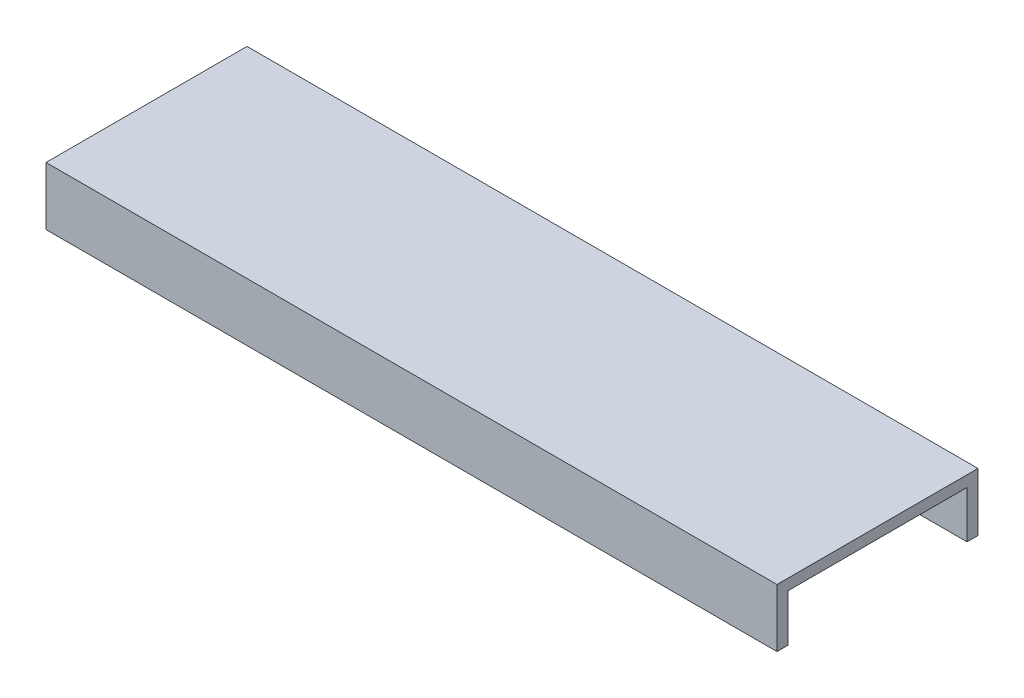
ISO-10303-21;
HEADER;
FILE_DESCRIPTION(('STEP AP214'),'2;1');
FILE_NAME('part.step','',(''),(''),'','','');
FILE_SCHEMA(('AUTOMOTIVE_DESIGN { 1 0 10303 214 1 1 1 1 }'));
ENDSEC;
DATA;
#1=APPLICATION_CONTEXT('core data for automotive mechanical design processes');
#2=APPLICATION_PROTOCOL_DEFINITION('international standard','automotive_design',2000,#1);
#3=PRODUCT_CONTEXT('',#1,'mechanical');
#4=PRODUCT('Part','Part','',(#3));
#5=PRODUCT_RELATED_PRODUCT_CATEGORY('part','',(#4));
#6=PRODUCT_DEFINITION_FORMATION('','',#4);
#7=PRODUCT_DEFINITION_CONTEXT('part definition',#1,'design');
#8=PRODUCT_DEFINITION('design','',#6,#7);
#9=PRODUCT_DEFINITION_SHAPE('','',#8);
#10=(LENGTH_UNIT() NAMED_UNIT(*) SI_UNIT(.MILLI.,.METRE.));
#11=(NAMED_UNIT(*) PLANE_ANGLE_UNIT() SI_UNIT($,.RADIAN.));
#12=(NAMED_UNIT(*) SI_UNIT($,.STERADIAN.) SOLID_ANGLE_UNIT());
#13=UNCERTAINTY_MEASURE_WITH_UNIT(LENGTH_MEASURE(1.E-05),#10,'distance_accuracy_value','');
#14=(GEOMETRIC_REPRESENTATION_CONTEXT(3) GLOBAL_UNCERTAINTY_ASSIGNED_CONTEXT((#13)) GLOBAL_UNIT_ASSIGNED_CONTEXT((#10,
#11,#12)) REPRESENTATION_CONTEXT('',''));
#15=CARTESIAN_POINT('',(0.,0.,0.));
#16=DIRECTION('',(0.,0.,1.));
#17=DIRECTION('',(1.,0.,0.));
#18=AXIS2_PLACEMENT_3D('',#15,#16,#17);
#19=CARTESIAN_POINT('',(100.,6.45,12.25));
#20=DIRECTION('',(0.,0.,1.));
#21=DIRECTION('',(1.,0.,0.));
#22=AXIS2_PLACEMENT_3D('',#19,#20,#21);
#23=PLANE('',#22);
#24=DIRECTION('',(0.,1.,0.));
#25=VECTOR('',#24,1.);
#26=CARTESIAN_POINT('',(0.,6.45,12.25));
#27=LINE('',#26,#25);
#28=CARTESIAN_POINT('',(0.,0.,12.25));
#29=VERTEX_POINT('',#28);
#30=CARTESIAN_POINT('',(0.,6.45,12.25));
#31=VERTEX_POINT('',#30);
#32=EDGE_CURVE('E146',#29,#31,#27,.T.);
#33=ORIENTED_EDGE('',*,*,#32,.T.);
#34=DIRECTION('',(-1.,0.,0.));
#35=VECTOR('',#34,1.);
#36=CARTESIAN_POINT('',(100.,6.45,12.25));
#37=LINE('',#36,#35);
#38=CARTESIAN_POINT('',(100.,6.45,12.25));
#39=VERTEX_POINT('',#38);
#40=EDGE_CURVE('E11',#39,#31,#37,.T.);
#41=ORIENTED_EDGE('',*,*,#40,.F.);
#42=DIRECTION('',(0.,1.,0.));
#43=VECTOR('',#42,1.);
#44=CARTESIAN_POINT('',(100.,6.45,12.25));
#45=LINE('',#44,#43);
#46=CARTESIAN_POINT('',(100.,0.,12.25));
#47=VERTEX_POINT('',#46);
#48=EDGE_CURVE('E168',#47,#39,#45,.T.);
#49=ORIENTED_EDGE('',*,*,#48,.F.);
#50=DIRECTION('',(-1.,0.,0.));
#51=VECTOR('',#50,1.);
#52=CARTESIAN_POINT('',(100.,0.,12.25));
#53=LINE('',#52,#51);
#54=EDGE_CURVE('E142',#47,#29,#53,.T.);
#55=ORIENTED_EDGE('',*,*,#54,.T.);
#56=EDGE_LOOP('',(#33,#41,#49,#55));
#57=FACE_BOUND('',#56,.T.);
#58=ADVANCED_FACE('F45',(#57),#23,.F.);
#59=CARTESIAN_POINT('',(100.,6.45,12.25));
#60=DIRECTION('',(0.,1.,0.));
#61=DIRECTION('',(0.,0.,1.));
#62=AXIS2_PLACEMENT_3D('',#59,#60,#61);
#63=PLANE('',#62);
#64=DIRECTION('',(0.,0.,-1.));
#65=VECTOR('',#64,1.);
#66=CARTESIAN_POINT('',(0.,6.45,12.25));
#67=LINE('',#66,#65);
#68=CARTESIAN_POINT('',(0.,6.45,-12.25));
#69=VERTEX_POINT('',#68);
#70=EDGE_CURVE('E150',#31,#69,#67,.T.);
#71=ORIENTED_EDGE('',*,*,#70,.T.);
#72=DIRECTION('',(-1.,0.,0.));
#73=VECTOR('',#72,1.);
#74=CARTESIAN_POINT('',(100.,6.45,-12.25));
#75=LINE('',#74,#73);
#76=CARTESIAN_POINT('',(100.,6.45,-12.25));
#77=VERTEX_POINT('',#76);
#78=EDGE_CURVE('E54',#77,#69,#75,.T.);
#79=ORIENTED_EDGE('',*,*,#78,.F.);
#80=DIRECTION('',(0.,0.,-1.));
#81=VECTOR('',#80,1.);
#82=CARTESIAN_POINT('',(100.,6.45,12.25));
#83=LINE('',#82,#81);
#84=EDGE_CURVE('E105',#39,#77,#83,.T.);
#85=ORIENTED_EDGE('',*,*,#84,.F.);
#86=ORIENTED_EDGE('',*,*,#40,.T.);
#87=EDGE_LOOP('',(#71,#79,#85,#86));
#88=FACE_BOUND('',#87,.T.);
#89=ADVANCED_FACE('F214',(#88),#63,.F.);
#90=CARTESIAN_POINT('',(100.,6.45,-12.25));
#91=DIRECTION('',(0.,0.,-1.));
#92=DIRECTION('',(-1.,0.,0.));
#93=AXIS2_PLACEMENT_3D('',#90,#91,#92);
#94=PLANE('',#93);
#95=DIRECTION('',(0.,-1.,0.));
#96=VECTOR('',#95,1.);
#97=CARTESIAN_POINT('',(0.,6.45,-12.25));
#98=LINE('',#97,#96);
#99=CARTESIAN_POINT('',(0.,0.,-12.25));
#100=VERTEX_POINT('',#99);
#101=EDGE_CURVE('E153',#69,#100,#98,.T.);
#102=ORIENTED_EDGE('',*,*,#101,.T.);
#103=DIRECTION('',(-1.,0.,0.));
#104=VECTOR('',#103,1.);
#105=CARTESIAN_POINT('',(100.,0.,-12.25));
#106=LINE('',#105,#104);
#107=CARTESIAN_POINT('',(100.,0.,-12.25));
#108=VERTEX_POINT('',#107);
#109=EDGE_CURVE('E179',#108,#100,#106,.T.);
#110=ORIENTED_EDGE('',*,*,#109,.F.);
#111=DIRECTION('',(0.,-1.,0.));
#112=VECTOR('',#111,1.);
#113=CARTESIAN_POINT('',(100.,6.45,-12.25));
#114=LINE('',#113,#112);
#115=EDGE_CURVE('E189',#77,#108,#114,.T.);
#116=ORIENTED_EDGE('',*,*,#115,.F.);
#117=ORIENTED_EDGE('',*,*,#78,.T.);
#118=EDGE_LOOP('',(#102,#110,#116,#117));
#119=FACE_BOUND('',#118,.T.);
#120=ADVANCED_FACE('F187',(#119),#94,.F.);
#121=CARTESIAN_POINT('',(100.,0.,-12.25));
#122=DIRECTION('',(0.,1.,0.));
#123=DIRECTION('',(0.,0.,1.));
#124=AXIS2_PLACEMENT_3D('',#121,#122,#123);
#125=PLANE('',#124);
#126=DIRECTION('',(0.,0.,-1.));
#127=VECTOR('',#126,1.);
#128=CARTESIAN_POINT('',(0.,0.,-12.25));
#129=LINE('',#128,#127);
#130=CARTESIAN_POINT('',(0.,0.,-13.75));
#131=VERTEX_POINT('',#130);
#132=EDGE_CURVE('E156',#100,#131,#129,.T.);
#133=ORIENTED_EDGE('',*,*,#132,.T.);
#134=DIRECTION('',(-1.,0.,0.));
#135=VECTOR('',#134,1.);
#136=CARTESIAN_POINT('',(100.,0.,-13.75));
#137=LINE('',#136,#135);
#138=CARTESIAN_POINT('',(100.,0.,-13.75));
#139=VERTEX_POINT('',#138);
#140=EDGE_CURVE('E175',#139,#131,#137,.T.);
#141=ORIENTED_EDGE('',*,*,#140,.F.);
#142=DIRECTION('',(0.,0.,-1.));
#143=VECTOR('',#142,1.);
#144=CARTESIAN_POINT('',(100.,0.,-12.25));
#145=LINE('',#144,#143);
#146=EDGE_CURVE('E202',#108,#139,#145,.T.);
#147=ORIENTED_EDGE('',*,*,#146,.F.);
#148=ORIENTED_EDGE('',*,*,#109,.T.);
#149=EDGE_LOOP('',(#133,#141,#147,#148));
#150=FACE_BOUND('',#149,.T.);
#151=ADVANCED_FACE('F197',(#150),#125,.F.);
#152=CARTESIAN_POINT('',(100.,7.95,-13.75));
#153=DIRECTION('',(0.,0.,1.));
#154=DIRECTION('',(0.,-1.,0.));
#155=AXIS2_PLACEMENT_3D('',#152,#153,#154);
#156=PLANE('',#155);
#157=DIRECTION('',(0.,1.,0.));
#158=VECTOR('',#157,1.);
#159=CARTESIAN_POINT('',(0.,7.95,-13.75));
#160=LINE('',#159,#158);
#161=CARTESIAN_POINT('',(0.,7.95,-13.75));
#162=VERTEX_POINT('',#161);
#163=EDGE_CURVE('E159',#131,#162,#160,.T.);
#164=ORIENTED_EDGE('',*,*,#163,.T.);
#165=DIRECTION('',(-1.,0.,0.));
#166=VECTOR('',#165,1.);
#167=CARTESIAN_POINT('',(100.,7.95,-13.75));
#168=LINE('',#167,#166);
#169=CARTESIAN_POINT('',(100.,7.95,-13.75));
#170=VERTEX_POINT('',#169);
#171=EDGE_CURVE('E135',#170,#162,#168,.T.);
#172=ORIENTED_EDGE('',*,*,#171,.F.);
#173=DIRECTION('',(0.,1.,0.));
#174=VECTOR('',#173,1.);
#175=CARTESIAN_POINT('',(100.,7.95,-13.75));
#176=LINE('',#175,#174);
#177=EDGE_CURVE('E124',#139,#170,#176,.T.);
#178=ORIENTED_EDGE('',*,*,#177,.F.);
#179=ORIENTED_EDGE('',*,*,#140,.T.);
#180=EDGE_LOOP('',(#164,#172,#178,#179));
#181=FACE_BOUND('',#180,.T.);
#182=ADVANCED_FACE('F200',(#181),#156,.F.);
#183=CARTESIAN_POINT('',(100.,7.95,13.75));
#184=DIRECTION('',(0.,-1.,0.));
#185=DIRECTION('',(0.,0.,-1.));
#186=AXIS2_PLACEMENT_3D('',#183,#184,#185);
#187=PLANE('',#186);
#188=DIRECTION('',(0.,0.,1.));
#189=VECTOR('',#188,1.);
#190=CARTESIAN_POINT('',(0.,7.95,13.75));
#191=LINE('',#190,#189);
#192=CARTESIAN_POINT('',(0.,7.95,13.75));
#193=VERTEX_POINT('',#192);
#194=EDGE_CURVE('E133',#162,#193,#191,.T.);
#195=ORIENTED_EDGE('',*,*,#194,.T.);
#196=DIRECTION('',(-1.,0.,0.));
#197=VECTOR('',#196,1.);
#198=CARTESIAN_POINT('',(100.,7.95,13.75));
#199=LINE('',#198,#197);
#200=CARTESIAN_POINT('',(100.,7.95,13.75));
#201=VERTEX_POINT('',#200);
#202=EDGE_CURVE('E130',#201,#193,#199,.T.);
#203=ORIENTED_EDGE('',*,*,#202,.F.);
#204=DIRECTION('',(0.,0.,1.));
#205=VECTOR('',#204,1.);
#206=CARTESIAN_POINT('',(100.,7.95,13.75));
#207=LINE('',#206,#205);
#208=EDGE_CURVE('E118',#170,#201,#207,.T.);
#209=ORIENTED_EDGE('',*,*,#208,.F.);
#210=ORIENTED_EDGE('',*,*,#171,.T.);
#211=EDGE_LOOP('',(#195,#203,#209,#210));
#212=FACE_BOUND('',#211,.T.);
#213=ADVANCED_FACE('F131',(#212),#187,.F.);
#214=CARTESIAN_POINT('',(100.,7.95,13.75));
#215=DIRECTION('',(0.,0.,-1.));
#216=DIRECTION('',(0.,1.,0.));
#217=AXIS2_PLACEMENT_3D('',#214,#215,#216);
#218=PLANE('',#217);
#219=DIRECTION('',(0.,-1.,0.));
#220=VECTOR('',#219,1.);
#221=CARTESIAN_POINT('',(0.,7.95,13.75));
#222=LINE('',#221,#220);
#223=CARTESIAN_POINT('',(0.,0.,13.75));
#224=VERTEX_POINT('',#223);
#225=EDGE_CURVE('E91',#193,#224,#222,.T.);
#226=ORIENTED_EDGE('',*,*,#225,.T.);
#227=DIRECTION('',(-1.,0.,0.));
#228=VECTOR('',#227,1.);
#229=CARTESIAN_POINT('',(100.,0.,13.75));
#230=LINE('',#229,#228);
#231=CARTESIAN_POINT('',(100.,0.,13.75));
#232=VERTEX_POINT('',#231);
#233=EDGE_CURVE('E136',#232,#224,#230,.T.);
#234=ORIENTED_EDGE('',*,*,#233,.F.);
#235=DIRECTION('',(0.,-1.,0.));
#236=VECTOR('',#235,1.);
#237=CARTESIAN_POINT('',(100.,7.95,13.75));
#238=LINE('',#237,#236);
#239=EDGE_CURVE('E122',#201,#232,#238,.T.);
#240=ORIENTED_EDGE('',*,*,#239,.F.);
#241=ORIENTED_EDGE('',*,*,#202,.T.);
#242=EDGE_LOOP('',(#226,#234,#240,#241));
#243=FACE_BOUND('',#242,.T.);
#244=ADVANCED_FACE('F138',(#243),#218,.F.);
#245=CARTESIAN_POINT('',(100.,0.,13.75));
#246=DIRECTION('',(0.,1.,0.));
#247=DIRECTION('',(0.,0.,1.));
#248=AXIS2_PLACEMENT_3D('',#245,#246,#247);
#249=PLANE('',#248);
#250=DIRECTION('',(0.,0.,-1.));
#251=VECTOR('',#250,1.);
#252=CARTESIAN_POINT('',(0.,0.,13.75));
#253=LINE('',#252,#251);
#254=EDGE_CURVE('E97',#224,#29,#253,.T.);
#255=ORIENTED_EDGE('',*,*,#254,.T.);
#256=ORIENTED_EDGE('',*,*,#54,.F.);
#257=DIRECTION('',(0.,0.,-1.));
#258=VECTOR('',#257,1.);
#259=CARTESIAN_POINT('',(100.,0.,13.75));
#260=LINE('',#259,#258);
#261=EDGE_CURVE('E62',#232,#47,#260,.T.);
#262=ORIENTED_EDGE('',*,*,#261,.F.);
#263=ORIENTED_EDGE('',*,*,#233,.T.);
#264=EDGE_LOOP('',(#255,#256,#262,#263));
#265=FACE_BOUND('',#264,.T.);
#266=ADVANCED_FACE('F230',(#265),#249,.F.);
#267=CARTESIAN_POINT('',(100.,0.,0.));
#268=DIRECTION('',(1.,0.,0.));
#269=DIRECTION('',(0.,0.,-1.));
#270=AXIS2_PLACEMENT_3D('',#267,#268,#269);
#271=PLANE('',#270);
#272=ORIENTED_EDGE('',*,*,#48,.T.);
#273=ORIENTED_EDGE('',*,*,#84,.T.);
#274=ORIENTED_EDGE('',*,*,#115,.T.);
#275=ORIENTED_EDGE('',*,*,#146,.T.);
#276=ORIENTED_EDGE('',*,*,#177,.T.);
#277=ORIENTED_EDGE('',*,*,#208,.T.);
#278=ORIENTED_EDGE('',*,*,#239,.T.);
#279=ORIENTED_EDGE('',*,*,#261,.T.);
#280=EDGE_LOOP('',(#272,#273,#274,#275,#276,#277,#278,#279));
#281=FACE_BOUND('',#280,.T.);
#282=ADVANCED_FACE('F120',(#281),#271,.T.);
#283=CARTESIAN_POINT('',(0.,0.,0.));
#284=DIRECTION('',(1.,0.,0.));
#285=DIRECTION('',(0.,0.,-1.));
#286=AXIS2_PLACEMENT_3D('',#283,#284,#285);
#287=PLANE('',#286);
#288=ORIENTED_EDGE('',*,*,#32,.F.);
#289=ORIENTED_EDGE('',*,*,#254,.F.);
#290=ORIENTED_EDGE('',*,*,#225,.F.);
#291=ORIENTED_EDGE('',*,*,#194,.F.);
#292=ORIENTED_EDGE('',*,*,#163,.F.);
#293=ORIENTED_EDGE('',*,*,#132,.F.);
#294=ORIENTED_EDGE('',*,*,#101,.F.);
#295=ORIENTED_EDGE('',*,*,#70,.F.);
#296=EDGE_LOOP('',(#288,#289,#290,#291,#292,#293,#294,#295));
#297=FACE_BOUND('',#296,.T.);
#298=ADVANCED_FACE('F193',(#297),#287,.F.);
#299=CLOSED_SHELL('',(#58,#89,#120,#151,#182,#213,#244,#266,#282,#298));
#300=MANIFOLD_SOLID_BREP('B2',#299);
#301=ADVANCED_BREP_SHAPE_REPRESENTATION('',(#18,#300),#14);
#302=SHAPE_DEFINITION_REPRESENTATION(#9,#301);
ENDSEC;
END-ISO-10303-21;
